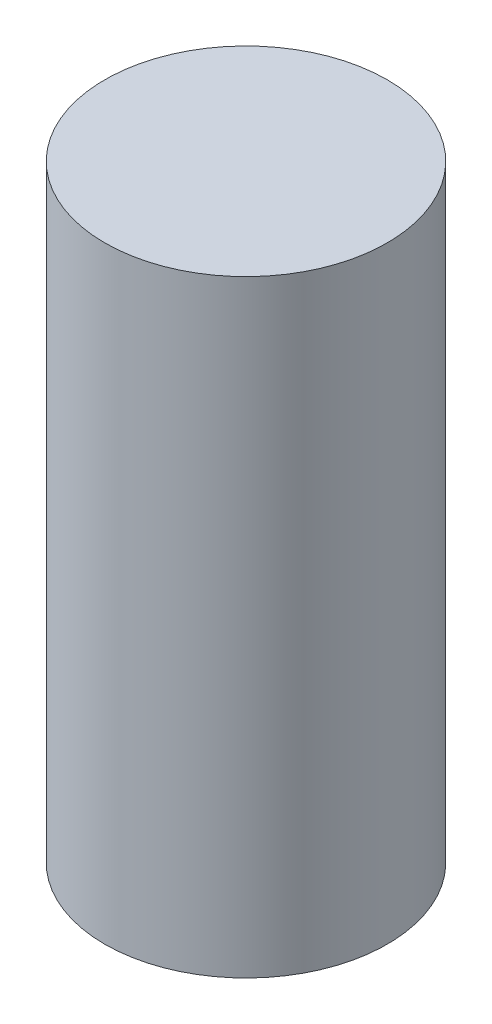
ISO-10303-21;
HEADER;
FILE_DESCRIPTION(('STEP AP214'),'2;1');
FILE_NAME('part.step','',(''),(''),'','','');
FILE_SCHEMA(('AUTOMOTIVE_DESIGN { 1 0 10303 214 1 1 1 1 }'));
ENDSEC;
DATA;
#1=APPLICATION_CONTEXT('core data for automotive mechanical design processes');
#2=APPLICATION_PROTOCOL_DEFINITION('international standard','automotive_design',2000,#1);
#3=PRODUCT_CONTEXT('',#1,'mechanical');
#4=PRODUCT('Part','Part','',(#3));
#5=PRODUCT_RELATED_PRODUCT_CATEGORY('part','',(#4));
#6=PRODUCT_DEFINITION_FORMATION('','',#4);
#7=PRODUCT_DEFINITION_CONTEXT('part definition',#1,'design');
#8=PRODUCT_DEFINITION('design','',#6,#7);
#9=PRODUCT_DEFINITION_SHAPE('','',#8);
#10=(LENGTH_UNIT() NAMED_UNIT(*) SI_UNIT(.MILLI.,.METRE.));
#11=(NAMED_UNIT(*) PLANE_ANGLE_UNIT() SI_UNIT($,.RADIAN.));
#12=(NAMED_UNIT(*) SI_UNIT($,.STERADIAN.) SOLID_ANGLE_UNIT());
#13=UNCERTAINTY_MEASURE_WITH_UNIT(LENGTH_MEASURE(1.E-05),#10,'distance_accuracy_value','');
#14=(GEOMETRIC_REPRESENTATION_CONTEXT(3) GLOBAL_UNCERTAINTY_ASSIGNED_CONTEXT((#13)) GLOBAL_UNIT_ASSIGNED_CONTEXT((#10,
#11,#12)) REPRESENTATION_CONTEXT('',''));
#15=CARTESIAN_POINT('',(0.,0.,0.));
#16=DIRECTION('',(0.,0.,1.));
#17=DIRECTION('',(1.,0.,0.));
#18=AXIS2_PLACEMENT_3D('',#15,#16,#17);
#19=CARTESIAN_POINT('',(0.,188.125,0.));
#20=DIRECTION('',(0.,-1.,0.));
#21=DIRECTION('',(0.,0.,-1.));
#22=AXIS2_PLACEMENT_3D('',#19,#20,#21);
#23=CYLINDRICAL_SURFACE('',#22,37.5);
#24=CARTESIAN_POINT('',(0.,188.125,0.));
#25=DIRECTION('',(0.,1.,0.));
#26=DIRECTION('',(0.,0.,1.));
#27=AXIS2_PLACEMENT_3D('',#24,#25,#26);
#28=CIRCLE('',#27,37.5);
#29=CARTESIAN_POINT('',(0.,188.125,37.5));
#30=VERTEX_POINT('',#29);
#31=EDGE_CURVE('E11',#30,#30,#28,.T.);
#32=ORIENTED_EDGE('',*,*,#31,.F.);
#33=EDGE_LOOP('',(#32));
#34=FACE_BOUND('',#33,.T.);
#35=CARTESIAN_POINT('',(0.,26.875,0.));
#36=DIRECTION('',(0.,1.,0.));
#37=DIRECTION('',(0.,0.,1.));
#38=AXIS2_PLACEMENT_3D('',#35,#36,#37);
#39=CIRCLE('',#38,37.5);
#40=CARTESIAN_POINT('',(0.,26.875,37.5));
#41=VERTEX_POINT('',#40);
#42=EDGE_CURVE('E47',#41,#41,#39,.T.);
#43=ORIENTED_EDGE('',*,*,#42,.T.);
#44=EDGE_LOOP('',(#43));
#45=FACE_BOUND('',#44,.T.);
#46=ADVANCED_FACE('F46',(#34,#45),#23,.T.);
#47=CARTESIAN_POINT('',(0.,188.125,0.));
#48=DIRECTION('',(0.,1.,0.));
#49=DIRECTION('',(0.,0.,1.));
#50=AXIS2_PLACEMENT_3D('',#47,#48,#49);
#51=PLANE('',#50);
#52=ORIENTED_EDGE('',*,*,#31,.T.);
#53=EDGE_LOOP('',(#52));
#54=FACE_BOUND('',#53,.T.);
#55=ADVANCED_FACE('F62',(#54),#51,.T.);
#56=CARTESIAN_POINT('',(0.,26.875,0.));
#57=DIRECTION('',(0.,1.,0.));
#58=DIRECTION('',(0.,0.,1.));
#59=AXIS2_PLACEMENT_3D('',#56,#57,#58);
#60=PLANE('',#59);
#61=ORIENTED_EDGE('',*,*,#42,.F.);
#62=EDGE_LOOP('',(#61));
#63=FACE_BOUND('',#62,.T.);
#64=ADVANCED_FACE('F56',(#63),#60,.F.);
#65=CLOSED_SHELL('',(#46,#55,#64));
#66=MANIFOLD_SOLID_BREP('B2',#65);
#67=ADVANCED_BREP_SHAPE_REPRESENTATION('',(#18,#66),#14);
#68=SHAPE_DEFINITION_REPRESENTATION(#9,#67);
ENDSEC;
END-ISO-10303-21;
